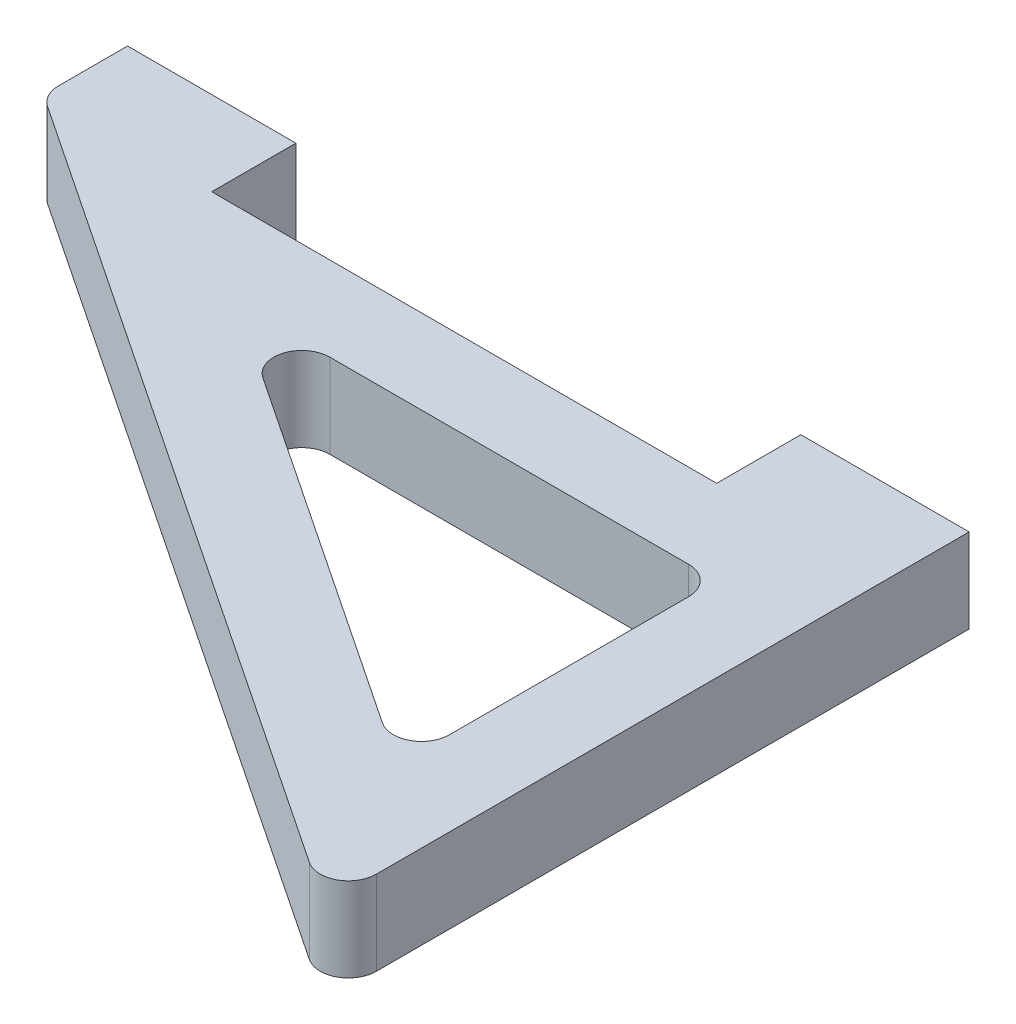
ISO-10303-21;
HEADER;
FILE_DESCRIPTION(('STEP AP214'),'2;1');
FILE_NAME('part.step','',(''),(''),'','','');
FILE_SCHEMA(('AUTOMOTIVE_DESIGN { 1 0 10303 214 1 1 1 1 }'));
ENDSEC;
DATA;
#1=APPLICATION_CONTEXT('core data for automotive mechanical design processes');
#2=APPLICATION_PROTOCOL_DEFINITION('international standard','automotive_design',2000,#1);
#3=PRODUCT_CONTEXT('',#1,'mechanical');
#4=PRODUCT('Part','Part','',(#3));
#5=PRODUCT_RELATED_PRODUCT_CATEGORY('part','',(#4));
#6=PRODUCT_DEFINITION_FORMATION('','',#4);
#7=PRODUCT_DEFINITION_CONTEXT('part definition',#1,'design');
#8=PRODUCT_DEFINITION('design','',#6,#7);
#9=PRODUCT_DEFINITION_SHAPE('','',#8);
#10=(LENGTH_UNIT() NAMED_UNIT(*) SI_UNIT(.MILLI.,.METRE.));
#11=(NAMED_UNIT(*) PLANE_ANGLE_UNIT() SI_UNIT($,.RADIAN.));
#12=(NAMED_UNIT(*) SI_UNIT($,.STERADIAN.) SOLID_ANGLE_UNIT());
#13=UNCERTAINTY_MEASURE_WITH_UNIT(LENGTH_MEASURE(1.E-05),#10,'distance_accuracy_value','');
#14=(GEOMETRIC_REPRESENTATION_CONTEXT(3) GLOBAL_UNCERTAINTY_ASSIGNED_CONTEXT((#13)) GLOBAL_UNIT_ASSIGNED_CONTEXT((#10,
#11,#12)) REPRESENTATION_CONTEXT('',''));
#15=CARTESIAN_POINT('',(0.,0.,0.));
#16=DIRECTION('',(0.,0.,1.));
#17=DIRECTION('',(1.,0.,0.));
#18=AXIS2_PLACEMENT_3D('',#15,#16,#17);
#19=CARTESIAN_POINT('',(0.,3.,0.));
#20=DIRECTION('',(0.,1.,0.));
#21=DIRECTION('',(0.,0.,1.));
#22=AXIS2_PLACEMENT_3D('',#19,#20,#21);
#23=PLANE('',#22);
#24=DIRECTION('',(0.,0.,1.));
#25=VECTOR('',#24,1.);
#26=CARTESIAN_POINT('',(-15.,3.,0.));
#27=LINE('',#26,#25);
#28=CARTESIAN_POINT('',(-15.,3.,-1.5));
#29=VERTEX_POINT('',#28);
#30=CARTESIAN_POINT('',(-15.,3.,0.964816241512005));
#31=VERTEX_POINT('',#30);
#32=EDGE_CURVE('E204',#29,#31,#27,.T.);
#33=ORIENTED_EDGE('',*,*,#32,.T.);
#34=CARTESIAN_POINT('',(-14.,3.,0.964816241512005));
#35=DIRECTION('',(0.,1.,0.));
#36=DIRECTION('',(0.,0.,1.));
#37=AXIS2_PLACEMENT_3D('',#34,#35,#36);
#38=CIRCLE('',#37,1.);
#39=CARTESIAN_POINT('',(-14.5547001962252,3.,1.79686653584985));
#40=VERTEX_POINT('',#39);
#41=EDGE_CURVE('E268',#31,#40,#38,.T.);
#42=ORIENTED_EDGE('',*,*,#41,.T.);
#43=DIRECTION('',(0.832050294337844,0.,0.554700196225229));
#44=VECTOR('',#43,1.);
#45=CARTESIAN_POINT('',(-5.30769230769231,3.,7.96153846153846));
#46=LINE('',#45,#44);
#47=CARTESIAN_POINT('',(13.4452998037748,3.,20.4635332025165));
#48=VERTEX_POINT('',#47);
#49=EDGE_CURVE('E169',#40,#48,#46,.T.);
#50=ORIENTED_EDGE('',*,*,#49,.T.);
#51=CARTESIAN_POINT('',(14.,3.,19.6314829081787));
#52=DIRECTION('',(0.,1.,0.));
#53=DIRECTION('',(0.,0.,1.));
#54=AXIS2_PLACEMENT_3D('',#51,#52,#53);
#55=CIRCLE('',#54,1.);
#56=CARTESIAN_POINT('',(15.,3.,19.6314829081787));
#57=VERTEX_POINT('',#56);
#58=EDGE_CURVE('E164',#48,#57,#55,.T.);
#59=ORIENTED_EDGE('',*,*,#58,.T.);
#60=DIRECTION('',(0.,0.,-1.));
#61=VECTOR('',#60,1.);
#62=CARTESIAN_POINT('',(15.,3.,0.));
#63=LINE('',#62,#61);
#64=CARTESIAN_POINT('',(15.,3.,-1.5));
#65=VERTEX_POINT('',#64);
#66=EDGE_CURVE('E157',#57,#65,#63,.T.);
#67=ORIENTED_EDGE('',*,*,#66,.T.);
#68=DIRECTION('',(1.,0.,0.));
#69=VECTOR('',#68,1.);
#70=CARTESIAN_POINT('',(0.,3.,-1.5));
#71=LINE('',#70,#69);
#72=CARTESIAN_POINT('',(9.,3.,-1.5));
#73=VERTEX_POINT('',#72);
#74=EDGE_CURVE('E161',#73,#65,#71,.T.);
#75=ORIENTED_EDGE('',*,*,#74,.F.);
#76=DIRECTION('',(0.,0.,1.));
#77=VECTOR('',#76,1.);
#78=CARTESIAN_POINT('',(9.,3.,0.));
#79=LINE('',#78,#77);
#80=CARTESIAN_POINT('',(9.,3.,1.5));
#81=VERTEX_POINT('',#80);
#82=EDGE_CURVE('E186',#73,#81,#79,.T.);
#83=ORIENTED_EDGE('',*,*,#82,.T.);
#84=DIRECTION('',(1.,0.,0.));
#85=VECTOR('',#84,1.);
#86=CARTESIAN_POINT('',(0.,3.,1.5));
#87=LINE('',#86,#85);
#88=CARTESIAN_POINT('',(-9.,3.,1.5));
#89=VERTEX_POINT('',#88);
#90=EDGE_CURVE('E189',#89,#81,#87,.T.);
#91=ORIENTED_EDGE('',*,*,#90,.F.);
#92=DIRECTION('',(0.,0.,1.));
#93=VECTOR('',#92,1.);
#94=CARTESIAN_POINT('',(-9.,3.,0.));
#95=LINE('',#94,#93);
#96=CARTESIAN_POINT('',(-9.,3.,-1.5));
#97=VERTEX_POINT('',#96);
#98=EDGE_CURVE('E196',#97,#89,#95,.T.);
#99=ORIENTED_EDGE('',*,*,#98,.F.);
#100=DIRECTION('',(1.,0.,0.));
#101=VECTOR('',#100,1.);
#102=CARTESIAN_POINT('',(0.,3.,-1.5));
#103=LINE('',#102,#101);
#104=EDGE_CURVE('E200',#29,#97,#103,.T.);
#105=ORIENTED_EDGE('',*,*,#104,.F.);
#106=EDGE_LOOP('',(#33,#42,#50,#59,#67,#75,#83,#91,#99,#105));
#107=FACE_BOUND('',#106,.T.);
#108=DIRECTION('',(1.,0.,0.));
#109=VECTOR('',#108,1.);
#110=CARTESIAN_POINT('',(0.,3.,4.5));
#111=LINE('',#110,#109);
#112=CARTESIAN_POINT('',(-1.78889744907202,3.,4.5));
#113=VERTEX_POINT('',#112);
#114=CARTESIAN_POINT('',(11.,3.,4.5));
#115=VERTEX_POINT('',#114);
#116=EDGE_CURVE('E399',#113,#115,#111,.T.);
#117=ORIENTED_EDGE('',*,*,#116,.T.);
#118=CARTESIAN_POINT('',(11.,3.,5.5));
#119=DIRECTION('',(0.,1.,0.));
#120=DIRECTION('',(0.,0.,1.));
#121=AXIS2_PLACEMENT_3D('',#118,#119,#120);
#122=CIRCLE('',#121,1.);
#123=CARTESIAN_POINT('',(12.,3.,5.5));
#124=VERTEX_POINT('',#123);
#125=EDGE_CURVE('E59',#115,#124,#122,.F.);
#126=ORIENTED_EDGE('',*,*,#125,.T.);
#127=DIRECTION('',(0.,0.,1.));
#128=VECTOR('',#127,1.);
#129=CARTESIAN_POINT('',(12.,3.,0.));
#130=LINE('',#129,#128);
#131=CARTESIAN_POINT('',(12.,3.,14.0259316327147));
#132=VERTEX_POINT('',#131);
#133=EDGE_CURVE('E402',#124,#132,#130,.T.);
#134=ORIENTED_EDGE('',*,*,#133,.T.);
#135=CARTESIAN_POINT('',(11.,3.,14.0259316327147));
#136=DIRECTION('',(0.,1.,0.));
#137=DIRECTION('',(0.,0.,1.));
#138=AXIS2_PLACEMENT_3D('',#135,#136,#137);
#139=CIRCLE('',#138,1.);
#140=CARTESIAN_POINT('',(10.4452998037748,3.,14.8579819270525));
#141=VERTEX_POINT('',#140);
#142=EDGE_CURVE('E294',#132,#141,#139,.F.);
#143=ORIENTED_EDGE('',*,*,#142,.T.);
#144=DIRECTION('',(-0.832050294337844,0.,-0.554700196225229));
#145=VECTOR('',#144,1.);
#146=CARTESIAN_POINT('',(-3.64359171901662,3.,5.46538757852493));
#147=LINE('',#146,#145);
#148=CARTESIAN_POINT('',(-2.34359764529725,3.,6.33205029433784));
#149=VERTEX_POINT('',#148);
#150=EDGE_CURVE('E406',#141,#149,#147,.T.);
#151=ORIENTED_EDGE('',*,*,#150,.T.);
#152=CARTESIAN_POINT('',(-1.78889744907202,3.,5.5));
#153=DIRECTION('',(0.,1.,0.));
#154=DIRECTION('',(0.,0.,1.));
#155=AXIS2_PLACEMENT_3D('',#152,#153,#154);
#156=CIRCLE('',#155,1.);
#157=EDGE_CURVE('E52',#149,#113,#156,.F.);
#158=ORIENTED_EDGE('',*,*,#157,.T.);
#159=EDGE_LOOP('',(#117,#126,#134,#143,#151,#158));
#160=FACE_BOUND('',#159,.T.);
#161=ADVANCED_FACE('F43',(#107,#160),#23,.T.);
#162=CARTESIAN_POINT('',(0.,0.,0.));
#163=DIRECTION('',(0.,1.,0.));
#164=DIRECTION('',(0.,0.,1.));
#165=AXIS2_PLACEMENT_3D('',#162,#163,#164);
#166=PLANE('',#165);
#167=DIRECTION('',(0.832050294337844,0.,0.554700196225229));
#168=VECTOR('',#167,1.);
#169=CARTESIAN_POINT('',(-5.30769230769231,0.,7.96153846153846));
#170=LINE('',#169,#168);
#171=CARTESIAN_POINT('',(-14.5547001962252,0.,1.79686653584985));
#172=VERTEX_POINT('',#171);
#173=CARTESIAN_POINT('',(13.4452998037748,0.,20.4635332025165));
#174=VERTEX_POINT('',#173);
#175=EDGE_CURVE('E208',#172,#174,#170,.T.);
#176=ORIENTED_EDGE('',*,*,#175,.F.);
#177=CARTESIAN_POINT('',(-14.,0.,0.964816241512005));
#178=DIRECTION('',(0.,1.,0.));
#179=DIRECTION('',(0.,0.,1.));
#180=AXIS2_PLACEMENT_3D('',#177,#178,#179);
#181=CIRCLE('',#180,1.);
#182=CARTESIAN_POINT('',(-15.,0.,0.964816241512005));
#183=VERTEX_POINT('',#182);
#184=EDGE_CURVE('E260',#172,#183,#181,.F.);
#185=ORIENTED_EDGE('',*,*,#184,.T.);
#186=DIRECTION('',(0.,0.,1.));
#187=VECTOR('',#186,1.);
#188=CARTESIAN_POINT('',(-15.,0.,0.));
#189=LINE('',#188,#187);
#190=CARTESIAN_POINT('',(-15.,0.,-1.5));
#191=VERTEX_POINT('',#190);
#192=EDGE_CURVE('E234',#191,#183,#189,.T.);
#193=ORIENTED_EDGE('',*,*,#192,.F.);
#194=DIRECTION('',(1.,0.,0.));
#195=VECTOR('',#194,1.);
#196=CARTESIAN_POINT('',(0.,0.,-1.5));
#197=LINE('',#196,#195);
#198=CARTESIAN_POINT('',(-9.,0.,-1.5));
#199=VERTEX_POINT('',#198);
#200=EDGE_CURVE('E230',#191,#199,#197,.T.);
#201=ORIENTED_EDGE('',*,*,#200,.T.);
#202=DIRECTION('',(0.,0.,1.));
#203=VECTOR('',#202,1.);
#204=CARTESIAN_POINT('',(-9.,0.,0.));
#205=LINE('',#204,#203);
#206=CARTESIAN_POINT('',(-9.,0.,1.5));
#207=VERTEX_POINT('',#206);
#208=EDGE_CURVE('E226',#199,#207,#205,.T.);
#209=ORIENTED_EDGE('',*,*,#208,.T.);
#210=DIRECTION('',(1.,0.,0.));
#211=VECTOR('',#210,1.);
#212=CARTESIAN_POINT('',(0.,0.,1.5));
#213=LINE('',#212,#211);
#214=CARTESIAN_POINT('',(9.,0.,1.5));
#215=VERTEX_POINT('',#214);
#216=EDGE_CURVE('E222',#207,#215,#213,.T.);
#217=ORIENTED_EDGE('',*,*,#216,.T.);
#218=DIRECTION('',(0.,0.,1.));
#219=VECTOR('',#218,1.);
#220=CARTESIAN_POINT('',(9.,0.,0.));
#221=LINE('',#220,#219);
#222=CARTESIAN_POINT('',(9.,0.,-1.5));
#223=VERTEX_POINT('',#222);
#224=EDGE_CURVE('E218',#223,#215,#221,.T.);
#225=ORIENTED_EDGE('',*,*,#224,.F.);
#226=DIRECTION('',(1.,0.,0.));
#227=VECTOR('',#226,1.);
#228=CARTESIAN_POINT('',(0.,0.,-1.5));
#229=LINE('',#228,#227);
#230=CARTESIAN_POINT('',(15.,0.,-1.5));
#231=VERTEX_POINT('',#230);
#232=EDGE_CURVE('E215',#223,#231,#229,.T.);
#233=ORIENTED_EDGE('',*,*,#232,.T.);
#234=DIRECTION('',(0.,0.,-1.));
#235=VECTOR('',#234,1.);
#236=CARTESIAN_POINT('',(15.,0.,0.));
#237=LINE('',#236,#235);
#238=CARTESIAN_POINT('',(15.,0.,19.6314829081787));
#239=VERTEX_POINT('',#238);
#240=EDGE_CURVE('E175',#239,#231,#237,.T.);
#241=ORIENTED_EDGE('',*,*,#240,.F.);
#242=CARTESIAN_POINT('',(14.,0.,19.6314829081787));
#243=DIRECTION('',(0.,1.,0.));
#244=DIRECTION('',(0.,0.,1.));
#245=AXIS2_PLACEMENT_3D('',#242,#243,#244);
#246=CIRCLE('',#245,1.);
#247=EDGE_CURVE('E257',#239,#174,#246,.F.);
#248=ORIENTED_EDGE('',*,*,#247,.T.);
#249=EDGE_LOOP('',(#176,#185,#193,#201,#209,#217,#225,#233,#241,#248));
#250=FACE_BOUND('',#249,.T.);
#251=DIRECTION('',(-1.,0.,0.));
#252=VECTOR('',#251,1.);
#253=CARTESIAN_POINT('',(0.,0.,4.5));
#254=LINE('',#253,#252);
#255=CARTESIAN_POINT('',(11.,0.,4.5));
#256=VERTEX_POINT('',#255);
#257=CARTESIAN_POINT('',(-1.78889744907202,0.,4.5));
#258=VERTEX_POINT('',#257);
#259=EDGE_CURVE('E311',#256,#258,#254,.T.);
#260=ORIENTED_EDGE('',*,*,#259,.T.);
#261=CARTESIAN_POINT('',(-1.78889744907202,0.,5.5));
#262=DIRECTION('',(0.,1.,0.));
#263=DIRECTION('',(0.,0.,1.));
#264=AXIS2_PLACEMENT_3D('',#261,#262,#263);
#265=CIRCLE('',#264,1.);
#266=CARTESIAN_POINT('',(-2.34359764529725,0.,6.33205029433784));
#267=VERTEX_POINT('',#266);
#268=EDGE_CURVE('E11',#258,#267,#265,.T.);
#269=ORIENTED_EDGE('',*,*,#268,.T.);
#270=DIRECTION('',(0.832050294337844,0.,0.554700196225229));
#271=VECTOR('',#270,1.);
#272=CARTESIAN_POINT('',(-3.64359171901662,0.,5.46538757852493));
#273=LINE('',#272,#271);
#274=CARTESIAN_POINT('',(10.4452998037748,0.,14.8579819270525));
#275=VERTEX_POINT('',#274);
#276=EDGE_CURVE('E318',#267,#275,#273,.T.);
#277=ORIENTED_EDGE('',*,*,#276,.T.);
#278=CARTESIAN_POINT('',(11.,0.,14.0259316327147));
#279=DIRECTION('',(0.,1.,0.));
#280=DIRECTION('',(0.,0.,1.));
#281=AXIS2_PLACEMENT_3D('',#278,#279,#280);
#282=CIRCLE('',#281,1.);
#283=CARTESIAN_POINT('',(12.,0.,14.0259316327147));
#284=VERTEX_POINT('',#283);
#285=EDGE_CURVE('E297',#275,#284,#282,.T.);
#286=ORIENTED_EDGE('',*,*,#285,.T.);
#287=DIRECTION('',(0.,0.,-1.));
#288=VECTOR('',#287,1.);
#289=CARTESIAN_POINT('',(12.,0.,0.));
#290=LINE('',#289,#288);
#291=CARTESIAN_POINT('',(12.,0.,5.5));
#292=VERTEX_POINT('',#291);
#293=EDGE_CURVE('E212',#284,#292,#290,.T.);
#294=ORIENTED_EDGE('',*,*,#293,.T.);
#295=CARTESIAN_POINT('',(11.,0.,5.5));
#296=DIRECTION('',(0.,1.,0.));
#297=DIRECTION('',(0.,0.,1.));
#298=AXIS2_PLACEMENT_3D('',#295,#296,#297);
#299=CIRCLE('',#298,1.);
#300=EDGE_CURVE('E302',#292,#256,#299,.T.);
#301=ORIENTED_EDGE('',*,*,#300,.T.);
#302=EDGE_LOOP('',(#260,#269,#277,#286,#294,#301));
#303=FACE_BOUND('',#302,.T.);
#304=ADVANCED_FACE('F310',(#250,#303),#166,.F.);
#305=CARTESIAN_POINT('',(-5.30769230769231,3.,7.96153846153846));
#306=DIRECTION('',(0.554700196225229,0.,-0.832050294337844));
#307=DIRECTION('',(-0.832050294337844,0.,-0.554700196225229));
#308=AXIS2_PLACEMENT_3D('',#305,#306,#307);
#309=PLANE('',#308);
#310=ORIENTED_EDGE('',*,*,#49,.F.);
#311=DIRECTION('',(0.,-1.,0.));
#312=VECTOR('',#311,1.);
#313=CARTESIAN_POINT('',(-14.5547001962252,3.,1.79686653584985));
#314=LINE('',#313,#312);
#315=EDGE_CURVE('E253',#40,#172,#314,.T.);
#316=ORIENTED_EDGE('',*,*,#315,.T.);
#317=ORIENTED_EDGE('',*,*,#175,.T.);
#318=DIRECTION('',(0.,-1.,0.));
#319=VECTOR('',#318,1.);
#320=CARTESIAN_POINT('',(13.4452998037748,3.,20.4635332025165));
#321=LINE('',#320,#319);
#322=EDGE_CURVE('E180',#174,#48,#321,.F.);
#323=ORIENTED_EDGE('',*,*,#322,.T.);
#324=EDGE_LOOP('',(#310,#316,#317,#323));
#325=FACE_BOUND('',#324,.T.);
#326=ADVANCED_FACE('F336',(#325),#309,.F.);
#327=CARTESIAN_POINT('',(15.,3.,0.));
#328=DIRECTION('',(-1.,0.,0.));
#329=DIRECTION('',(0.,0.,1.));
#330=AXIS2_PLACEMENT_3D('',#327,#328,#329);
#331=PLANE('',#330);
#332=ORIENTED_EDGE('',*,*,#66,.F.);
#333=DIRECTION('',(0.,-1.,0.));
#334=VECTOR('',#333,1.);
#335=CARTESIAN_POINT('',(15.,3.,19.6314829081787));
#336=LINE('',#335,#334);
#337=EDGE_CURVE('E271',#57,#239,#336,.T.);
#338=ORIENTED_EDGE('',*,*,#337,.T.);
#339=ORIENTED_EDGE('',*,*,#240,.T.);
#340=DIRECTION('',(0.,-1.,0.));
#341=VECTOR('',#340,1.);
#342=CARTESIAN_POINT('',(15.,3.,-1.5));
#343=LINE('',#342,#341);
#344=EDGE_CURVE('E172',#65,#231,#343,.T.);
#345=ORIENTED_EDGE('',*,*,#344,.F.);
#346=EDGE_LOOP('',(#332,#338,#339,#345));
#347=FACE_BOUND('',#346,.T.);
#348=ADVANCED_FACE('F173',(#347),#331,.F.);
#349=CARTESIAN_POINT('',(0.,3.,-1.5));
#350=DIRECTION('',(0.,0.,-1.));
#351=DIRECTION('',(-1.,0.,0.));
#352=AXIS2_PLACEMENT_3D('',#349,#350,#351);
#353=PLANE('',#352);
#354=ORIENTED_EDGE('',*,*,#232,.F.);
#355=DIRECTION('',(0.,-1.,0.));
#356=VECTOR('',#355,1.);
#357=CARTESIAN_POINT('',(9.,3.,-1.5));
#358=LINE('',#357,#356);
#359=EDGE_CURVE('E181',#73,#223,#358,.T.);
#360=ORIENTED_EDGE('',*,*,#359,.F.);
#361=ORIENTED_EDGE('',*,*,#74,.T.);
#362=ORIENTED_EDGE('',*,*,#344,.T.);
#363=EDGE_LOOP('',(#354,#360,#361,#362));
#364=FACE_BOUND('',#363,.T.);
#365=ADVANCED_FACE('F183',(#364),#353,.T.);
#366=CARTESIAN_POINT('',(9.,3.,0.));
#367=DIRECTION('',(1.,0.,0.));
#368=DIRECTION('',(0.,0.,-1.));
#369=AXIS2_PLACEMENT_3D('',#366,#367,#368);
#370=PLANE('',#369);
#371=ORIENTED_EDGE('',*,*,#224,.T.);
#372=DIRECTION('',(0.,-1.,0.));
#373=VECTOR('',#372,1.);
#374=CARTESIAN_POINT('',(9.,3.,1.5));
#375=LINE('',#374,#373);
#376=EDGE_CURVE('E246',#81,#215,#375,.T.);
#377=ORIENTED_EDGE('',*,*,#376,.F.);
#378=ORIENTED_EDGE('',*,*,#82,.F.);
#379=ORIENTED_EDGE('',*,*,#359,.T.);
#380=EDGE_LOOP('',(#371,#377,#378,#379));
#381=FACE_BOUND('',#380,.T.);
#382=ADVANCED_FACE('F358',(#381),#370,.F.);
#383=CARTESIAN_POINT('',(0.,3.,1.5));
#384=DIRECTION('',(0.,0.,-1.));
#385=DIRECTION('',(-1.,0.,0.));
#386=AXIS2_PLACEMENT_3D('',#383,#384,#385);
#387=PLANE('',#386);
#388=ORIENTED_EDGE('',*,*,#216,.F.);
#389=DIRECTION('',(0.,-1.,0.));
#390=VECTOR('',#389,1.);
#391=CARTESIAN_POINT('',(-9.,3.,1.5));
#392=LINE('',#391,#390);
#393=EDGE_CURVE('E243',#89,#207,#392,.T.);
#394=ORIENTED_EDGE('',*,*,#393,.F.);
#395=ORIENTED_EDGE('',*,*,#90,.T.);
#396=ORIENTED_EDGE('',*,*,#376,.T.);
#397=EDGE_LOOP('',(#388,#394,#395,#396));
#398=FACE_BOUND('',#397,.T.);
#399=ADVANCED_FACE('F354',(#398),#387,.T.);
#400=CARTESIAN_POINT('',(-9.,3.,0.));
#401=DIRECTION('',(1.,0.,0.));
#402=DIRECTION('',(0.,0.,-1.));
#403=AXIS2_PLACEMENT_3D('',#400,#401,#402);
#404=PLANE('',#403);
#405=ORIENTED_EDGE('',*,*,#208,.F.);
#406=DIRECTION('',(0.,-1.,0.));
#407=VECTOR('',#406,1.);
#408=CARTESIAN_POINT('',(-9.,3.,-1.5));
#409=LINE('',#408,#407);
#410=EDGE_CURVE('E240',#97,#199,#409,.T.);
#411=ORIENTED_EDGE('',*,*,#410,.F.);
#412=ORIENTED_EDGE('',*,*,#98,.T.);
#413=ORIENTED_EDGE('',*,*,#393,.T.);
#414=EDGE_LOOP('',(#405,#411,#412,#413));
#415=FACE_BOUND('',#414,.T.);
#416=ADVANCED_FACE('F350',(#415),#404,.T.);
#417=CARTESIAN_POINT('',(0.,3.,-1.5));
#418=DIRECTION('',(0.,0.,-1.));
#419=DIRECTION('',(-1.,0.,0.));
#420=AXIS2_PLACEMENT_3D('',#417,#418,#419);
#421=PLANE('',#420);
#422=ORIENTED_EDGE('',*,*,#200,.F.);
#423=DIRECTION('',(0.,-1.,0.));
#424=VECTOR('',#423,1.);
#425=CARTESIAN_POINT('',(-15.,3.,-1.5));
#426=LINE('',#425,#424);
#427=EDGE_CURVE('E207',#29,#191,#426,.T.);
#428=ORIENTED_EDGE('',*,*,#427,.F.);
#429=ORIENTED_EDGE('',*,*,#104,.T.);
#430=ORIENTED_EDGE('',*,*,#410,.T.);
#431=EDGE_LOOP('',(#422,#428,#429,#430));
#432=FACE_BOUND('',#431,.T.);
#433=ADVANCED_FACE('F346',(#432),#421,.T.);
#434=CARTESIAN_POINT('',(-15.,3.,0.));
#435=DIRECTION('',(1.,0.,0.));
#436=DIRECTION('',(0.,0.,-1.));
#437=AXIS2_PLACEMENT_3D('',#434,#435,#436);
#438=PLANE('',#437);
#439=ORIENTED_EDGE('',*,*,#192,.T.);
#440=DIRECTION('',(0.,-1.,0.));
#441=VECTOR('',#440,1.);
#442=CARTESIAN_POINT('',(-15.,3.,0.964816241512005));
#443=LINE('',#442,#441);
#444=EDGE_CURVE('E263',#183,#31,#443,.F.);
#445=ORIENTED_EDGE('',*,*,#444,.T.);
#446=ORIENTED_EDGE('',*,*,#32,.F.);
#447=ORIENTED_EDGE('',*,*,#427,.T.);
#448=EDGE_LOOP('',(#439,#445,#446,#447));
#449=FACE_BOUND('',#448,.T.);
#450=ADVANCED_FACE('F343',(#449),#438,.F.);
#451=CARTESIAN_POINT('',(-3.64359171901662,-0.00100000000000013,5.46538757852493));
#452=DIRECTION('',(0.554700196225229,0.,-0.832050294337844));
#453=DIRECTION('',(-0.832050294337844,0.,-0.554700196225229));
#454=AXIS2_PLACEMENT_3D('',#451,#452,#453);
#455=PLANE('',#454);
#456=ORIENTED_EDGE('',*,*,#150,.F.);
#457=DIRECTION('',(0.,1.,0.));
#458=VECTOR('',#457,1.);
#459=CARTESIAN_POINT('',(10.4452998037748,0.,14.8579819270525));
#460=LINE('',#459,#458);
#461=EDGE_CURVE('E285',#141,#275,#460,.F.);
#462=ORIENTED_EDGE('',*,*,#461,.T.);
#463=ORIENTED_EDGE('',*,*,#276,.F.);
#464=DIRECTION('',(0.,1.,0.));
#465=VECTOR('',#464,1.);
#466=CARTESIAN_POINT('',(-2.34359764529725,3.,6.33205029433784));
#467=LINE('',#466,#465);
#468=EDGE_CURVE('E281',#267,#149,#467,.T.);
#469=ORIENTED_EDGE('',*,*,#468,.T.);
#470=EDGE_LOOP('',(#456,#462,#463,#469));
#471=FACE_BOUND('',#470,.T.);
#472=ADVANCED_FACE('F340',(#471),#455,.T.);
#473=CARTESIAN_POINT('',(0.,-0.00100000000000013,4.5));
#474=DIRECTION('',(0.,0.,1.));
#475=DIRECTION('',(1.,0.,0.));
#476=AXIS2_PLACEMENT_3D('',#473,#474,#475);
#477=PLANE('',#476);
#478=ORIENTED_EDGE('',*,*,#259,.F.);
#479=DIRECTION('',(0.,1.,0.));
#480=VECTOR('',#479,1.);
#481=CARTESIAN_POINT('',(11.,3.,4.5));
#482=LINE('',#481,#480);
#483=EDGE_CURVE('E291',#256,#115,#482,.T.);
#484=ORIENTED_EDGE('',*,*,#483,.T.);
#485=ORIENTED_EDGE('',*,*,#116,.F.);
#486=DIRECTION('',(0.,1.,0.));
#487=VECTOR('',#486,1.);
#488=CARTESIAN_POINT('',(-1.78889744907202,0.,4.5));
#489=LINE('',#488,#487);
#490=EDGE_CURVE('E288',#113,#258,#489,.F.);
#491=ORIENTED_EDGE('',*,*,#490,.T.);
#492=EDGE_LOOP('',(#478,#484,#485,#491));
#493=FACE_BOUND('',#492,.T.);
#494=ADVANCED_FACE('F315',(#493),#477,.T.);
#495=CARTESIAN_POINT('',(12.,-0.00100000000000013,0.));
#496=DIRECTION('',(-1.,0.,0.));
#497=DIRECTION('',(0.,0.,1.));
#498=AXIS2_PLACEMENT_3D('',#495,#496,#497);
#499=PLANE('',#498);
#500=ORIENTED_EDGE('',*,*,#293,.F.);
#501=DIRECTION('',(0.,1.,0.));
#502=VECTOR('',#501,1.);
#503=CARTESIAN_POINT('',(12.,3.,14.0259316327147));
#504=LINE('',#503,#502);
#505=EDGE_CURVE('E277',#284,#132,#504,.T.);
#506=ORIENTED_EDGE('',*,*,#505,.T.);
#507=ORIENTED_EDGE('',*,*,#133,.F.);
#508=DIRECTION('',(0.,1.,0.));
#509=VECTOR('',#508,1.);
#510=CARTESIAN_POINT('',(12.,0.,5.5));
#511=LINE('',#510,#509);
#512=EDGE_CURVE('E274',#124,#292,#511,.F.);
#513=ORIENTED_EDGE('',*,*,#512,.T.);
#514=EDGE_LOOP('',(#500,#506,#507,#513));
#515=FACE_BOUND('',#514,.T.);
#516=ADVANCED_FACE('F373',(#515),#499,.T.);
#517=CARTESIAN_POINT('',(-14.,3.,0.964816241512005));
#518=DIRECTION('',(0.,-1.,0.));
#519=DIRECTION('',(0.,0.,-1.));
#520=AXIS2_PLACEMENT_3D('',#517,#518,#519);
#521=CYLINDRICAL_SURFACE('',#520,1.);
#522=ORIENTED_EDGE('',*,*,#41,.F.);
#523=ORIENTED_EDGE('',*,*,#444,.F.);
#524=ORIENTED_EDGE('',*,*,#184,.F.);
#525=ORIENTED_EDGE('',*,*,#315,.F.);
#526=EDGE_LOOP('',(#522,#523,#524,#525));
#527=FACE_BOUND('',#526,.T.);
#528=ADVANCED_FACE('F370',(#527),#521,.T.);
#529=CARTESIAN_POINT('',(14.,3.,19.6314829081787));
#530=DIRECTION('',(0.,-1.,0.));
#531=DIRECTION('',(0.,0.,-1.));
#532=AXIS2_PLACEMENT_3D('',#529,#530,#531);
#533=CYLINDRICAL_SURFACE('',#532,1.);
#534=ORIENTED_EDGE('',*,*,#58,.F.);
#535=ORIENTED_EDGE('',*,*,#322,.F.);
#536=ORIENTED_EDGE('',*,*,#247,.F.);
#537=ORIENTED_EDGE('',*,*,#337,.F.);
#538=EDGE_LOOP('',(#534,#535,#536,#537));
#539=FACE_BOUND('',#538,.T.);
#540=ADVANCED_FACE('F328',(#539),#533,.T.);
#541=CARTESIAN_POINT('',(11.,-0.00100000000000013,14.0259316327147));
#542=DIRECTION('',(0.,-1.,0.));
#543=DIRECTION('',(0.,0.,-1.));
#544=AXIS2_PLACEMENT_3D('',#541,#542,#543);
#545=CYLINDRICAL_SURFACE('',#544,1.);
#546=ORIENTED_EDGE('',*,*,#285,.F.);
#547=ORIENTED_EDGE('',*,*,#461,.F.);
#548=ORIENTED_EDGE('',*,*,#142,.F.);
#549=ORIENTED_EDGE('',*,*,#505,.F.);
#550=EDGE_LOOP('',(#546,#547,#548,#549));
#551=FACE_BOUND('',#550,.T.);
#552=ADVANCED_FACE('F322',(#551),#545,.F.);
#553=CARTESIAN_POINT('',(11.,-0.00100000000000013,5.5));
#554=DIRECTION('',(0.,-1.,0.));
#555=DIRECTION('',(0.,0.,-1.));
#556=AXIS2_PLACEMENT_3D('',#553,#554,#555);
#557=CYLINDRICAL_SURFACE('',#556,1.);
#558=ORIENTED_EDGE('',*,*,#300,.F.);
#559=ORIENTED_EDGE('',*,*,#512,.F.);
#560=ORIENTED_EDGE('',*,*,#125,.F.);
#561=ORIENTED_EDGE('',*,*,#483,.F.);
#562=EDGE_LOOP('',(#558,#559,#560,#561));
#563=FACE_BOUND('',#562,.T.);
#564=ADVANCED_FACE('F320',(#563),#557,.F.);
#565=CARTESIAN_POINT('',(-1.78889744907202,-0.00100000000000013,5.5));
#566=DIRECTION('',(0.,-1.,0.));
#567=DIRECTION('',(0.,0.,-1.));
#568=AXIS2_PLACEMENT_3D('',#565,#566,#567);
#569=CYLINDRICAL_SURFACE('',#568,1.);
#570=ORIENTED_EDGE('',*,*,#268,.F.);
#571=ORIENTED_EDGE('',*,*,#490,.F.);
#572=ORIENTED_EDGE('',*,*,#157,.F.);
#573=ORIENTED_EDGE('',*,*,#468,.F.);
#574=EDGE_LOOP('',(#570,#571,#572,#573));
#575=FACE_BOUND('',#574,.T.);
#576=ADVANCED_FACE('F45',(#575),#569,.F.);
#577=CLOSED_SHELL('',(#161,#304,#326,#348,#365,#382,#399,#416,#433,#450,#472,#494,#516,#528,
#540,#552,#564,#576));
#578=MANIFOLD_SOLID_BREP('B2',#577);
#579=ADVANCED_BREP_SHAPE_REPRESENTATION('',(#18,#578),#14);
#580=SHAPE_DEFINITION_REPRESENTATION(#9,#579);
ENDSEC;
END-ISO-10303-21;
